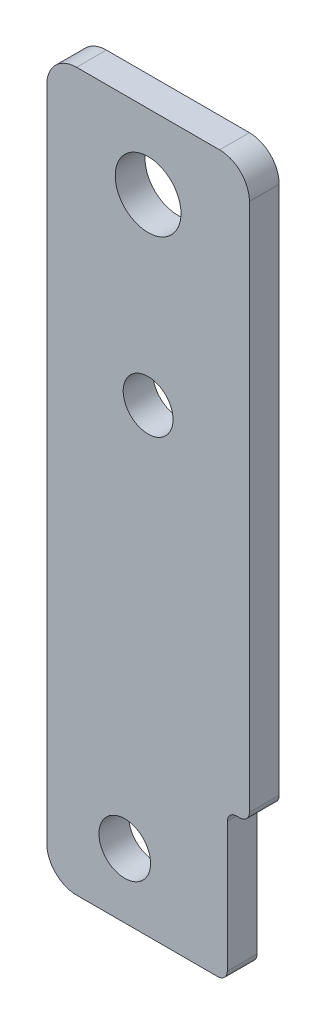
ISO-10303-21;
HEADER;
FILE_DESCRIPTION(('STEP AP214'),'2;1');
FILE_NAME('part.step','',(''),(''),'','','');
FILE_SCHEMA(('AUTOMOTIVE_DESIGN { 1 0 10303 214 1 1 1 1 }'));
ENDSEC;
DATA;
#1=APPLICATION_CONTEXT('core data for automotive mechanical design processes');
#2=APPLICATION_PROTOCOL_DEFINITION('international standard','automotive_design',2000,#1);
#3=PRODUCT_CONTEXT('',#1,'mechanical');
#4=PRODUCT('Part','Part','',(#3));
#5=PRODUCT_RELATED_PRODUCT_CATEGORY('part','',(#4));
#6=PRODUCT_DEFINITION_FORMATION('','',#4);
#7=PRODUCT_DEFINITION_CONTEXT('part definition',#1,'design');
#8=PRODUCT_DEFINITION('design','',#6,#7);
#9=PRODUCT_DEFINITION_SHAPE('','',#8);
#10=(LENGTH_UNIT() NAMED_UNIT(*) SI_UNIT(.MILLI.,.METRE.));
#11=(NAMED_UNIT(*) PLANE_ANGLE_UNIT() SI_UNIT($,.RADIAN.));
#12=(NAMED_UNIT(*) SI_UNIT($,.STERADIAN.) SOLID_ANGLE_UNIT());
#13=UNCERTAINTY_MEASURE_WITH_UNIT(LENGTH_MEASURE(1.E-05),#10,'distance_accuracy_value','');
#14=(GEOMETRIC_REPRESENTATION_CONTEXT(3) GLOBAL_UNCERTAINTY_ASSIGNED_CONTEXT((#13)) GLOBAL_UNIT_ASSIGNED_CONTEXT((#10,
#11,#12)) REPRESENTATION_CONTEXT('',''));
#15=CARTESIAN_POINT('',(0.,0.,0.));
#16=DIRECTION('',(0.,0.,1.));
#17=DIRECTION('',(1.,0.,0.));
#18=AXIS2_PLACEMENT_3D('',#15,#16,#17);
#19=CARTESIAN_POINT('',(0.,0.,3.175));
#20=DIRECTION('',(0.,0.,-1.));
#21=DIRECTION('',(-1.,0.,0.));
#22=AXIS2_PLACEMENT_3D('',#19,#20,#21);
#23=PLANE('',#22);
#24=DIRECTION('',(-1.,0.,0.));
#25=VECTOR('',#24,1.);
#26=CARTESIAN_POINT('',(10.9760422494493,-29.4457539254202,3.175));
#27=LINE('',#26,#25);
#28=CARTESIAN_POINT('',(9.79499999999999,-29.4457539254202,3.175));
#29=VERTEX_POINT('',#28);
#30=CARTESIAN_POINT('',(9.43604224944931,-29.4457539254202,3.175));
#31=VERTEX_POINT('',#30);
#32=EDGE_CURVE('E237',#29,#31,#27,.T.);
#33=ORIENTED_EDGE('',*,*,#32,.F.);
#34=CARTESIAN_POINT('',(9.79499999999999,-28.4457539254202,3.175));
#35=DIRECTION('',(0.,0.,-1.));
#36=DIRECTION('',(-1.,0.,0.));
#37=AXIS2_PLACEMENT_3D('',#34,#35,#36);
#38=CIRCLE('',#37,1.);
#39=CARTESIAN_POINT('',(10.795,-28.4457539254202,3.175));
#40=VERTEX_POINT('',#39);
#41=EDGE_CURVE('E221',#29,#40,#38,.F.);
#42=ORIENTED_EDGE('',*,*,#41,.T.);
#43=DIRECTION('',(0.,1.,0.));
#44=VECTOR('',#43,1.);
#45=CARTESIAN_POINT('',(10.795,-45.2786257873186,3.175));
#46=LINE('',#45,#44);
#47=CARTESIAN_POINT('',(10.795,27.94,3.175));
#48=VERTEX_POINT('',#47);
#49=EDGE_CURVE('E167',#40,#48,#46,.T.);
#50=ORIENTED_EDGE('',*,*,#49,.T.);
#51=CARTESIAN_POINT('',(7.62000000000002,27.94,3.175));
#52=DIRECTION('',(0.,0.,-1.));
#53=DIRECTION('',(-1.,0.,0.));
#54=AXIS2_PLACEMENT_3D('',#51,#52,#53);
#55=CIRCLE('',#54,3.175);
#56=CARTESIAN_POINT('',(7.62000000000002,31.115,3.175));
#57=VERTEX_POINT('',#56);
#58=EDGE_CURVE('E189',#48,#57,#55,.F.);
#59=ORIENTED_EDGE('',*,*,#58,.T.);
#60=DIRECTION('',(-1.,0.,0.));
#61=VECTOR('',#60,1.);
#62=CARTESIAN_POINT('',(-10.795,31.115,3.175));
#63=LINE('',#62,#61);
#64=CARTESIAN_POINT('',(-7.61999999999998,31.115,3.175));
#65=VERTEX_POINT('',#64);
#66=EDGE_CURVE('E292',#57,#65,#63,.T.);
#67=ORIENTED_EDGE('',*,*,#66,.T.);
#68=CARTESIAN_POINT('',(-7.61999999999999,27.94,3.175));
#69=DIRECTION('',(0.,0.,-1.));
#70=DIRECTION('',(-1.,0.,0.));
#71=AXIS2_PLACEMENT_3D('',#68,#69,#70);
#72=CIRCLE('',#71,3.175);
#73=CARTESIAN_POINT('',(-10.795,27.94,3.175));
#74=VERTEX_POINT('',#73);
#75=EDGE_CURVE('E192',#65,#74,#72,.F.);
#76=ORIENTED_EDGE('',*,*,#75,.T.);
#77=DIRECTION('',(0.,-1.,0.));
#78=VECTOR('',#77,1.);
#79=CARTESIAN_POINT('',(-10.795,31.115,3.175));
#80=LINE('',#79,#78);
#81=CARTESIAN_POINT('',(-10.795,-42.1036257873186,3.175));
#82=VERTEX_POINT('',#81);
#83=EDGE_CURVE('E152',#74,#82,#80,.T.);
#84=ORIENTED_EDGE('',*,*,#83,.T.);
#85=CARTESIAN_POINT('',(-7.61999999999999,-42.1036257873186,3.175));
#86=DIRECTION('',(0.,0.,-1.));
#87=DIRECTION('',(-1.,0.,0.));
#88=AXIS2_PLACEMENT_3D('',#85,#86,#87);
#89=CIRCLE('',#88,3.175);
#90=CARTESIAN_POINT('',(-7.61999999999999,-45.2786257873186,3.175));
#91=VERTEX_POINT('',#90);
#92=EDGE_CURVE('E186',#82,#91,#89,.F.);
#93=ORIENTED_EDGE('',*,*,#92,.T.);
#94=DIRECTION('',(1.,0.,0.));
#95=VECTOR('',#94,1.);
#96=CARTESIAN_POINT('',(-10.795,-45.2786257873186,3.175));
#97=LINE('',#96,#95);
#98=CARTESIAN_POINT('',(7.4360422494493,-45.2786257873186,3.175));
#99=VERTEX_POINT('',#98);
#100=EDGE_CURVE('E174',#91,#99,#97,.T.);
#101=ORIENTED_EDGE('',*,*,#100,.T.);
#102=CARTESIAN_POINT('',(7.43604224944931,-44.2786257873186,3.175));
#103=DIRECTION('',(0.,0.,-1.));
#104=DIRECTION('',(-1.,0.,0.));
#105=AXIS2_PLACEMENT_3D('',#102,#103,#104);
#106=CIRCLE('',#105,1.);
#107=CARTESIAN_POINT('',(8.43604224944931,-44.2786257873186,3.175));
#108=VERTEX_POINT('',#107);
#109=EDGE_CURVE('E62',#99,#108,#106,.F.);
#110=ORIENTED_EDGE('',*,*,#109,.T.);
#111=DIRECTION('',(0.,-1.,0.));
#112=VECTOR('',#111,1.);
#113=CARTESIAN_POINT('',(8.43604224944931,-45.3137692599018,3.175));
#114=LINE('',#113,#112);
#115=CARTESIAN_POINT('',(8.43604224944931,-30.4457539254202,3.175));
#116=VERTEX_POINT('',#115);
#117=EDGE_CURVE('E239',#116,#108,#114,.T.);
#118=ORIENTED_EDGE('',*,*,#117,.F.);
#119=CARTESIAN_POINT('',(9.43604224944931,-30.4457539254202,3.175));
#120=DIRECTION('',(0.,0.,-1.));
#121=DIRECTION('',(-1.,0.,0.));
#122=AXIS2_PLACEMENT_3D('',#119,#120,#121);
#123=CIRCLE('',#122,1.);
#124=EDGE_CURVE('E48',#116,#31,#123,.T.);
#125=ORIENTED_EDGE('',*,*,#124,.T.);
#126=EDGE_LOOP('',(#33,#42,#50,#59,#67,#76,#84,#93,#101,#110,#118,#125));
#127=FACE_BOUND('',#126,.T.);
#128=CARTESIAN_POINT('',(0.,23.1775,3.175));
#129=DIRECTION('',(0.,0.,1.));
#130=DIRECTION('',(1.,0.,0.));
#131=AXIS2_PLACEMENT_3D('',#128,#129,#130);
#132=CIRCLE('',#131,3.5052);
#133=CARTESIAN_POINT('',(3.5052,23.1775,3.175));
#134=VERTEX_POINT('',#133);
#135=EDGE_CURVE('E283',#134,#134,#132,.T.);
#136=ORIENTED_EDGE('',*,*,#135,.F.);
#137=EDGE_LOOP('',(#136));
#138=FACE_BOUND('',#137,.T.);
#139=CARTESIAN_POINT('',(-6.93889390390723E-13,3.73443621168798,3.175));
#140=DIRECTION('',(0.,0.,1.));
#141=DIRECTION('',(1.,0.,0.));
#142=AXIS2_PLACEMENT_3D('',#139,#140,#141);
#143=CIRCLE('',#142,2.65400000005286);
#144=CARTESIAN_POINT('',(2.65400000005216,3.73443621168798,3.175));
#145=VERTEX_POINT('',#144);
#146=EDGE_CURVE('E275',#145,#145,#143,.T.);
#147=ORIENTED_EDGE('',*,*,#146,.F.);
#148=EDGE_LOOP('',(#147));
#149=FACE_BOUND('',#148,.T.);
#150=CARTESIAN_POINT('',(-2.4892,-38.41242,3.175));
#151=DIRECTION('',(0.,0.,1.));
#152=DIRECTION('',(1.,0.,0.));
#153=AXIS2_PLACEMENT_3D('',#150,#151,#152);
#154=CIRCLE('',#153,2.75082);
#155=CARTESIAN_POINT('',(0.261619999999999,-38.41242,3.175));
#156=VERTEX_POINT('',#155);
#157=EDGE_CURVE('E265',#156,#156,#154,.T.);
#158=ORIENTED_EDGE('',*,*,#157,.F.);
#159=EDGE_LOOP('',(#158));
#160=FACE_BOUND('',#159,.T.);
#161=ADVANCED_FACE('F39',(#127,#138,#149,#160),#23,.F.);
#162=CARTESIAN_POINT('',(0.,0.,0.));
#163=DIRECTION('',(0.,0.,-1.));
#164=DIRECTION('',(-1.,0.,0.));
#165=AXIS2_PLACEMENT_3D('',#162,#163,#164);
#166=PLANE('',#165);
#167=DIRECTION('',(0.,1.,0.));
#168=VECTOR('',#167,1.);
#169=CARTESIAN_POINT('',(10.795,31.115,0.));
#170=LINE('',#169,#168);
#171=CARTESIAN_POINT('',(10.795,-28.4457539254202,0.));
#172=VERTEX_POINT('',#171);
#173=CARTESIAN_POINT('',(10.795,27.94,0.));
#174=VERTEX_POINT('',#173);
#175=EDGE_CURVE('E169',#172,#174,#170,.T.);
#176=ORIENTED_EDGE('',*,*,#175,.F.);
#177=CARTESIAN_POINT('',(9.79499999999999,-28.4457539254202,0.));
#178=DIRECTION('',(0.,0.,-1.));
#179=DIRECTION('',(-1.,0.,0.));
#180=AXIS2_PLACEMENT_3D('',#177,#178,#179);
#181=CIRCLE('',#180,1.);
#182=CARTESIAN_POINT('',(9.79499999999999,-29.4457539254202,0.));
#183=VERTEX_POINT('',#182);
#184=EDGE_CURVE('E210',#172,#183,#181,.T.);
#185=ORIENTED_EDGE('',*,*,#184,.T.);
#186=DIRECTION('',(-1.,0.,0.));
#187=VECTOR('',#186,1.);
#188=CARTESIAN_POINT('',(10.9760422494493,-29.4457539254202,0.));
#189=LINE('',#188,#187);
#190=CARTESIAN_POINT('',(9.43604224944931,-29.4457539254202,0.));
#191=VERTEX_POINT('',#190);
#192=EDGE_CURVE('E255',#183,#191,#189,.T.);
#193=ORIENTED_EDGE('',*,*,#192,.T.);
#194=CARTESIAN_POINT('',(9.43604224944931,-30.4457539254202,0.));
#195=DIRECTION('',(0.,0.,-1.));
#196=DIRECTION('',(-1.,0.,0.));
#197=AXIS2_PLACEMENT_3D('',#194,#195,#196);
#198=CIRCLE('',#197,1.);
#199=CARTESIAN_POINT('',(8.43604224944931,-30.4457539254202,0.));
#200=VERTEX_POINT('',#199);
#201=EDGE_CURVE('E11',#191,#200,#198,.F.);
#202=ORIENTED_EDGE('',*,*,#201,.T.);
#203=DIRECTION('',(0.,-1.,0.));
#204=VECTOR('',#203,1.);
#205=CARTESIAN_POINT('',(8.43604224944931,-45.3137692599018,0.));
#206=LINE('',#205,#204);
#207=CARTESIAN_POINT('',(8.43604224944931,-44.2786257873186,0.));
#208=VERTEX_POINT('',#207);
#209=EDGE_CURVE('E254',#200,#208,#206,.T.);
#210=ORIENTED_EDGE('',*,*,#209,.T.);
#211=CARTESIAN_POINT('',(7.43604224944931,-44.2786257873186,0.));
#212=DIRECTION('',(0.,0.,-1.));
#213=DIRECTION('',(-1.,0.,0.));
#214=AXIS2_PLACEMENT_3D('',#211,#212,#213);
#215=CIRCLE('',#214,1.);
#216=CARTESIAN_POINT('',(7.4360422494493,-45.2786257873186,0.));
#217=VERTEX_POINT('',#216);
#218=EDGE_CURVE('E207',#208,#217,#215,.T.);
#219=ORIENTED_EDGE('',*,*,#218,.T.);
#220=DIRECTION('',(1.,0.,0.));
#221=VECTOR('',#220,1.);
#222=CARTESIAN_POINT('',(-10.795,-45.2786257873186,0.));
#223=LINE('',#222,#221);
#224=CARTESIAN_POINT('',(-7.61999999999999,-45.2786257873186,0.));
#225=VERTEX_POINT('',#224);
#226=EDGE_CURVE('E162',#225,#217,#223,.T.);
#227=ORIENTED_EDGE('',*,*,#226,.F.);
#228=CARTESIAN_POINT('',(-7.61999999999999,-42.1036257873186,0.));
#229=DIRECTION('',(0.,0.,-1.));
#230=DIRECTION('',(-1.,0.,0.));
#231=AXIS2_PLACEMENT_3D('',#228,#229,#230);
#232=CIRCLE('',#231,3.175);
#233=CARTESIAN_POINT('',(-10.795,-42.1036257873186,0.));
#234=VERTEX_POINT('',#233);
#235=EDGE_CURVE('E154',#225,#234,#232,.T.);
#236=ORIENTED_EDGE('',*,*,#235,.T.);
#237=DIRECTION('',(0.,-1.,0.));
#238=VECTOR('',#237,1.);
#239=CARTESIAN_POINT('',(-10.795,-31.115,0.));
#240=LINE('',#239,#238);
#241=CARTESIAN_POINT('',(-10.795,27.94,0.));
#242=VERTEX_POINT('',#241);
#243=EDGE_CURVE('E149',#242,#234,#240,.T.);
#244=ORIENTED_EDGE('',*,*,#243,.F.);
#245=CARTESIAN_POINT('',(-7.61999999999999,27.94,0.));
#246=DIRECTION('',(0.,0.,-1.));
#247=DIRECTION('',(-1.,0.,0.));
#248=AXIS2_PLACEMENT_3D('',#245,#246,#247);
#249=CIRCLE('',#248,3.175);
#250=CARTESIAN_POINT('',(-7.61999999999998,31.115,0.));
#251=VERTEX_POINT('',#250);
#252=EDGE_CURVE('E131',#242,#251,#249,.T.);
#253=ORIENTED_EDGE('',*,*,#252,.T.);
#254=DIRECTION('',(-1.,0.,0.));
#255=VECTOR('',#254,1.);
#256=CARTESIAN_POINT('',(-10.795,31.115,0.));
#257=LINE('',#256,#255);
#258=CARTESIAN_POINT('',(7.62000000000002,31.115,0.));
#259=VERTEX_POINT('',#258);
#260=EDGE_CURVE('E163',#259,#251,#257,.T.);
#261=ORIENTED_EDGE('',*,*,#260,.F.);
#262=CARTESIAN_POINT('',(7.62000000000002,27.94,0.));
#263=DIRECTION('',(0.,0.,-1.));
#264=DIRECTION('',(-1.,0.,0.));
#265=AXIS2_PLACEMENT_3D('',#262,#263,#264);
#266=CIRCLE('',#265,3.175);
#267=EDGE_CURVE('E143',#259,#174,#266,.T.);
#268=ORIENTED_EDGE('',*,*,#267,.T.);
#269=EDGE_LOOP('',(#176,#185,#193,#202,#210,#219,#227,#236,#244,#253,#261,#268));
#270=FACE_BOUND('',#269,.T.);
#271=CARTESIAN_POINT('',(-6.93889390390723E-13,3.73443621168798,0.));
#272=DIRECTION('',(0.,0.,1.));
#273=DIRECTION('',(1.,0.,0.));
#274=AXIS2_PLACEMENT_3D('',#271,#272,#273);
#275=CIRCLE('',#274,2.65400000005286);
#276=CARTESIAN_POINT('',(2.65400000005216,3.73443621168798,0.));
#277=VERTEX_POINT('',#276);
#278=EDGE_CURVE('E273',#277,#277,#275,.T.);
#279=ORIENTED_EDGE('',*,*,#278,.T.);
#280=EDGE_LOOP('',(#279));
#281=FACE_BOUND('',#280,.T.);
#282=CARTESIAN_POINT('',(0.,23.1775,0.));
#283=DIRECTION('',(0.,0.,1.));
#284=DIRECTION('',(1.,0.,0.));
#285=AXIS2_PLACEMENT_3D('',#282,#283,#284);
#286=CIRCLE('',#285,3.5052);
#287=CARTESIAN_POINT('',(3.5052,23.1775,0.));
#288=VERTEX_POINT('',#287);
#289=EDGE_CURVE('E279',#288,#288,#286,.T.);
#290=ORIENTED_EDGE('',*,*,#289,.T.);
#291=EDGE_LOOP('',(#290));
#292=FACE_BOUND('',#291,.T.);
#293=CARTESIAN_POINT('',(-2.4892,-38.41242,0.));
#294=DIRECTION('',(0.,0.,1.));
#295=DIRECTION('',(1.,0.,0.));
#296=AXIS2_PLACEMENT_3D('',#293,#294,#295);
#297=CIRCLE('',#296,2.75082);
#298=CARTESIAN_POINT('',(0.261619999999999,-38.41242,0.));
#299=VERTEX_POINT('',#298);
#300=EDGE_CURVE('E260',#299,#299,#297,.T.);
#301=ORIENTED_EDGE('',*,*,#300,.T.);
#302=EDGE_LOOP('',(#301));
#303=FACE_BOUND('',#302,.T.);
#304=ADVANCED_FACE('F158',(#270,#281,#292,#303),#166,.T.);
#305=CARTESIAN_POINT('',(10.795,31.115,3.175));
#306=DIRECTION('',(-1.,0.,0.));
#307=DIRECTION('',(0.,-1.,0.));
#308=AXIS2_PLACEMENT_3D('',#305,#306,#307);
#309=PLANE('',#308);
#310=ORIENTED_EDGE('',*,*,#49,.F.);
#311=DIRECTION('',(0.,0.,-1.));
#312=VECTOR('',#311,1.);
#313=CARTESIAN_POINT('',(10.795,-28.4457539254202,3.175));
#314=LINE('',#313,#312);
#315=EDGE_CURVE('E203',#40,#172,#314,.T.);
#316=ORIENTED_EDGE('',*,*,#315,.T.);
#317=ORIENTED_EDGE('',*,*,#175,.T.);
#318=DIRECTION('',(0.,0.,-1.));
#319=VECTOR('',#318,1.);
#320=CARTESIAN_POINT('',(10.795,27.94,3.175));
#321=LINE('',#320,#319);
#322=EDGE_CURVE('E195',#174,#48,#321,.F.);
#323=ORIENTED_EDGE('',*,*,#322,.T.);
#324=EDGE_LOOP('',(#310,#316,#317,#323));
#325=FACE_BOUND('',#324,.T.);
#326=ADVANCED_FACE('F302',(#325),#309,.F.);
#327=CARTESIAN_POINT('',(-10.795,31.115,3.175));
#328=DIRECTION('',(0.,-1.,0.));
#329=DIRECTION('',(1.,0.,0.));
#330=AXIS2_PLACEMENT_3D('',#327,#328,#329);
#331=PLANE('',#330);
#332=ORIENTED_EDGE('',*,*,#260,.T.);
#333=DIRECTION('',(0.,0.,-1.));
#334=VECTOR('',#333,1.);
#335=CARTESIAN_POINT('',(-7.61999999999998,31.115,3.175));
#336=LINE('',#335,#334);
#337=EDGE_CURVE('E136',#251,#65,#336,.F.);
#338=ORIENTED_EDGE('',*,*,#337,.T.);
#339=ORIENTED_EDGE('',*,*,#66,.F.);
#340=DIRECTION('',(0.,0.,-1.));
#341=VECTOR('',#340,1.);
#342=CARTESIAN_POINT('',(7.62000000000002,31.115,3.175));
#343=LINE('',#342,#341);
#344=EDGE_CURVE('E142',#57,#259,#343,.T.);
#345=ORIENTED_EDGE('',*,*,#344,.T.);
#346=EDGE_LOOP('',(#332,#338,#339,#345));
#347=FACE_BOUND('',#346,.T.);
#348=ADVANCED_FACE('F311',(#347),#331,.F.);
#349=CARTESIAN_POINT('',(-10.795,-31.115,3.175));
#350=DIRECTION('',(1.,0.,0.));
#351=DIRECTION('',(0.,0.,-1.));
#352=AXIS2_PLACEMENT_3D('',#349,#350,#351);
#353=PLANE('',#352);
#354=ORIENTED_EDGE('',*,*,#83,.F.);
#355=DIRECTION('',(0.,0.,-1.));
#356=VECTOR('',#355,1.);
#357=CARTESIAN_POINT('',(-10.795,27.94,3.175));
#358=LINE('',#357,#356);
#359=EDGE_CURVE('E135',#74,#242,#358,.T.);
#360=ORIENTED_EDGE('',*,*,#359,.T.);
#361=ORIENTED_EDGE('',*,*,#243,.T.);
#362=DIRECTION('',(0.,0.,-1.));
#363=VECTOR('',#362,1.);
#364=CARTESIAN_POINT('',(-10.795,-42.1036257873186,3.175));
#365=LINE('',#364,#363);
#366=EDGE_CURVE('E155',#234,#82,#365,.F.);
#367=ORIENTED_EDGE('',*,*,#366,.T.);
#368=EDGE_LOOP('',(#354,#360,#361,#367));
#369=FACE_BOUND('',#368,.T.);
#370=ADVANCED_FACE('F148',(#369),#353,.F.);
#371=CARTESIAN_POINT('',(-10.795,-45.2786257873186,3.175));
#372=DIRECTION('',(0.,1.,0.));
#373=DIRECTION('',(0.,0.,1.));
#374=AXIS2_PLACEMENT_3D('',#371,#372,#373);
#375=PLANE('',#374);
#376=ORIENTED_EDGE('',*,*,#226,.T.);
#377=DIRECTION('',(0.,0.,-1.));
#378=VECTOR('',#377,1.);
#379=CARTESIAN_POINT('',(7.43604224944931,-45.2786257873186,3.175));
#380=LINE('',#379,#378);
#381=EDGE_CURVE('E55',#217,#99,#380,.F.);
#382=ORIENTED_EDGE('',*,*,#381,.T.);
#383=ORIENTED_EDGE('',*,*,#100,.F.);
#384=DIRECTION('',(0.,0.,-1.));
#385=VECTOR('',#384,1.);
#386=CARTESIAN_POINT('',(-7.61999999999999,-45.2786257873186,3.175));
#387=LINE('',#386,#385);
#388=EDGE_CURVE('E199',#91,#225,#387,.T.);
#389=ORIENTED_EDGE('',*,*,#388,.T.);
#390=EDGE_LOOP('',(#376,#382,#383,#389));
#391=FACE_BOUND('',#390,.T.);
#392=ADVANCED_FACE('F318',(#391),#375,.F.);
#393=CARTESIAN_POINT('',(0.,23.1775,3.175));
#394=DIRECTION('',(0.,0.,-1.));
#395=DIRECTION('',(-1.,0.,0.));
#396=AXIS2_PLACEMENT_3D('',#393,#394,#395);
#397=CYLINDRICAL_SURFACE('',#396,3.5052);
#398=ORIENTED_EDGE('',*,*,#135,.T.);
#399=EDGE_LOOP('',(#398));
#400=FACE_BOUND('',#399,.T.);
#401=ORIENTED_EDGE('',*,*,#289,.F.);
#402=EDGE_LOOP('',(#401));
#403=FACE_BOUND('',#402,.T.);
#404=ADVANCED_FACE('F328',(#400,#403),#397,.F.);
#405=CARTESIAN_POINT('',(-6.93889390390723E-13,3.73443621168798,3.175));
#406=DIRECTION('',(0.,0.,-1.));
#407=DIRECTION('',(-1.,0.,0.));
#408=AXIS2_PLACEMENT_3D('',#405,#406,#407);
#409=CYLINDRICAL_SURFACE('',#408,2.65400000005286);
#410=ORIENTED_EDGE('',*,*,#146,.T.);
#411=EDGE_LOOP('',(#410));
#412=FACE_BOUND('',#411,.T.);
#413=ORIENTED_EDGE('',*,*,#278,.F.);
#414=EDGE_LOOP('',(#413));
#415=FACE_BOUND('',#414,.T.);
#416=ADVANCED_FACE('F335',(#412,#415),#409,.F.);
#417=CARTESIAN_POINT('',(-2.4892,-38.41242,3.175));
#418=DIRECTION('',(0.,0.,-1.));
#419=DIRECTION('',(-1.,0.,0.));
#420=AXIS2_PLACEMENT_3D('',#417,#418,#419);
#421=CYLINDRICAL_SURFACE('',#420,2.75082);
#422=ORIENTED_EDGE('',*,*,#157,.T.);
#423=EDGE_LOOP('',(#422));
#424=FACE_BOUND('',#423,.T.);
#425=ORIENTED_EDGE('',*,*,#300,.F.);
#426=EDGE_LOOP('',(#425));
#427=FACE_BOUND('',#426,.T.);
#428=ADVANCED_FACE('F357',(#424,#427),#421,.F.);
#429=CARTESIAN_POINT('',(-7.61999999999999,27.94,3.175));
#430=DIRECTION('',(0.,0.,-1.));
#431=DIRECTION('',(-1.,0.,0.));
#432=AXIS2_PLACEMENT_3D('',#429,#430,#431);
#433=CYLINDRICAL_SURFACE('',#432,3.175);
#434=ORIENTED_EDGE('',*,*,#75,.F.);
#435=ORIENTED_EDGE('',*,*,#337,.F.);
#436=ORIENTED_EDGE('',*,*,#252,.F.);
#437=ORIENTED_EDGE('',*,*,#359,.F.);
#438=EDGE_LOOP('',(#434,#435,#436,#437));
#439=FACE_BOUND('',#438,.T.);
#440=ADVANCED_FACE('F134',(#439),#433,.T.);
#441=CARTESIAN_POINT('',(7.62000000000002,27.94,3.175));
#442=DIRECTION('',(0.,0.,-1.));
#443=DIRECTION('',(-1.,0.,0.));
#444=AXIS2_PLACEMENT_3D('',#441,#442,#443);
#445=CYLINDRICAL_SURFACE('',#444,3.175);
#446=ORIENTED_EDGE('',*,*,#58,.F.);
#447=ORIENTED_EDGE('',*,*,#322,.F.);
#448=ORIENTED_EDGE('',*,*,#267,.F.);
#449=ORIENTED_EDGE('',*,*,#344,.F.);
#450=EDGE_LOOP('',(#446,#447,#448,#449));
#451=FACE_BOUND('',#450,.T.);
#452=ADVANCED_FACE('F308',(#451),#445,.T.);
#453=CARTESIAN_POINT('',(-7.61999999999999,-42.1036257873186,3.175));
#454=DIRECTION('',(0.,0.,-1.));
#455=DIRECTION('',(-1.,0.,0.));
#456=AXIS2_PLACEMENT_3D('',#453,#454,#455);
#457=CYLINDRICAL_SURFACE('',#456,3.175);
#458=ORIENTED_EDGE('',*,*,#92,.F.);
#459=ORIENTED_EDGE('',*,*,#366,.F.);
#460=ORIENTED_EDGE('',*,*,#235,.F.);
#461=ORIENTED_EDGE('',*,*,#388,.F.);
#462=EDGE_LOOP('',(#458,#459,#460,#461));
#463=FACE_BOUND('',#462,.T.);
#464=ADVANCED_FACE('F350',(#463),#457,.T.);
#465=CARTESIAN_POINT('',(10.9760422494493,-29.4457539254202,0.));
#466=DIRECTION('',(0.,1.,0.));
#467=DIRECTION('',(0.,0.,1.));
#468=AXIS2_PLACEMENT_3D('',#465,#466,#467);
#469=PLANE('',#468);
#470=ORIENTED_EDGE('',*,*,#192,.F.);
#471=DIRECTION('',(0.,0.,-1.));
#472=VECTOR('',#471,1.);
#473=CARTESIAN_POINT('',(9.79499999999999,-29.4457539254202,0.));
#474=LINE('',#473,#472);
#475=EDGE_CURVE('E216',#183,#29,#474,.F.);
#476=ORIENTED_EDGE('',*,*,#475,.T.);
#477=ORIENTED_EDGE('',*,*,#32,.T.);
#478=DIRECTION('',(0.,0.,1.));
#479=VECTOR('',#478,1.);
#480=CARTESIAN_POINT('',(9.43604224944931,-29.4457539254202,0.));
#481=LINE('',#480,#479);
#482=EDGE_CURVE('E213',#31,#191,#481,.F.);
#483=ORIENTED_EDGE('',*,*,#482,.T.);
#484=EDGE_LOOP('',(#470,#476,#477,#483));
#485=FACE_BOUND('',#484,.T.);
#486=ADVANCED_FACE('F245',(#485),#469,.F.);
#487=CARTESIAN_POINT('',(8.43604224944931,-45.3137692599018,0.));
#488=DIRECTION('',(-1.,0.,0.));
#489=DIRECTION('',(0.,0.,1.));
#490=AXIS2_PLACEMENT_3D('',#487,#488,#489);
#491=PLANE('',#490);
#492=ORIENTED_EDGE('',*,*,#209,.F.);
#493=DIRECTION('',(0.,0.,1.));
#494=VECTOR('',#493,1.);
#495=CARTESIAN_POINT('',(8.43604224944931,-30.4457539254202,3.175));
#496=LINE('',#495,#494);
#497=EDGE_CURVE('E228',#200,#116,#496,.T.);
#498=ORIENTED_EDGE('',*,*,#497,.T.);
#499=ORIENTED_EDGE('',*,*,#117,.T.);
#500=DIRECTION('',(0.,0.,-1.));
#501=VECTOR('',#500,1.);
#502=CARTESIAN_POINT('',(8.43604224944931,-44.2786257873186,0.));
#503=LINE('',#502,#501);
#504=EDGE_CURVE('E224',#108,#208,#503,.T.);
#505=ORIENTED_EDGE('',*,*,#504,.T.);
#506=EDGE_LOOP('',(#492,#498,#499,#505));
#507=FACE_BOUND('',#506,.T.);
#508=ADVANCED_FACE('F257',(#507),#491,.F.);
#509=CARTESIAN_POINT('',(9.79499999999999,-28.4457539254202,3.175));
#510=DIRECTION('',(0.,0.,-1.));
#511=DIRECTION('',(-1.,0.,0.));
#512=AXIS2_PLACEMENT_3D('',#509,#510,#511);
#513=CYLINDRICAL_SURFACE('',#512,1.);
#514=ORIENTED_EDGE('',*,*,#41,.F.);
#515=ORIENTED_EDGE('',*,*,#475,.F.);
#516=ORIENTED_EDGE('',*,*,#184,.F.);
#517=ORIENTED_EDGE('',*,*,#315,.F.);
#518=EDGE_LOOP('',(#514,#515,#516,#517));
#519=FACE_BOUND('',#518,.T.);
#520=ADVANCED_FACE('F343',(#519),#513,.T.);
#521=CARTESIAN_POINT('',(9.43604224944931,-30.4457539254202,0.));
#522=DIRECTION('',(0.,0.,-1.));
#523=DIRECTION('',(-1.,0.,0.));
#524=AXIS2_PLACEMENT_3D('',#521,#522,#523);
#525=CYLINDRICAL_SURFACE('',#524,1.);
#526=ORIENTED_EDGE('',*,*,#201,.F.);
#527=ORIENTED_EDGE('',*,*,#482,.F.);
#528=ORIENTED_EDGE('',*,*,#124,.F.);
#529=ORIENTED_EDGE('',*,*,#497,.F.);
#530=EDGE_LOOP('',(#526,#527,#528,#529));
#531=FACE_BOUND('',#530,.T.);
#532=ADVANCED_FACE('F251',(#531),#525,.F.);
#533=CARTESIAN_POINT('',(7.43604224944931,-44.2786257873186,0.));
#534=DIRECTION('',(0.,0.,-1.));
#535=DIRECTION('',(-1.,0.,0.));
#536=AXIS2_PLACEMENT_3D('',#533,#534,#535);
#537=CYLINDRICAL_SURFACE('',#536,1.);
#538=ORIENTED_EDGE('',*,*,#109,.F.);
#539=ORIENTED_EDGE('',*,*,#381,.F.);
#540=ORIENTED_EDGE('',*,*,#218,.F.);
#541=ORIENTED_EDGE('',*,*,#504,.F.);
#542=EDGE_LOOP('',(#538,#539,#540,#541));
#543=FACE_BOUND('',#542,.T.);
#544=ADVANCED_FACE('F41',(#543),#537,.T.);
#545=CLOSED_SHELL('',(#161,#304,#326,#348,#370,#392,#404,#416,#428,#440,#452,#464,#486,#508,
#520,#532,#544));
#546=MANIFOLD_SOLID_BREP('B2',#545);
#547=ADVANCED_BREP_SHAPE_REPRESENTATION('',(#18,#546),#14);
#548=SHAPE_DEFINITION_REPRESENTATION(#9,#547);
ENDSEC;
END-ISO-10303-21;
